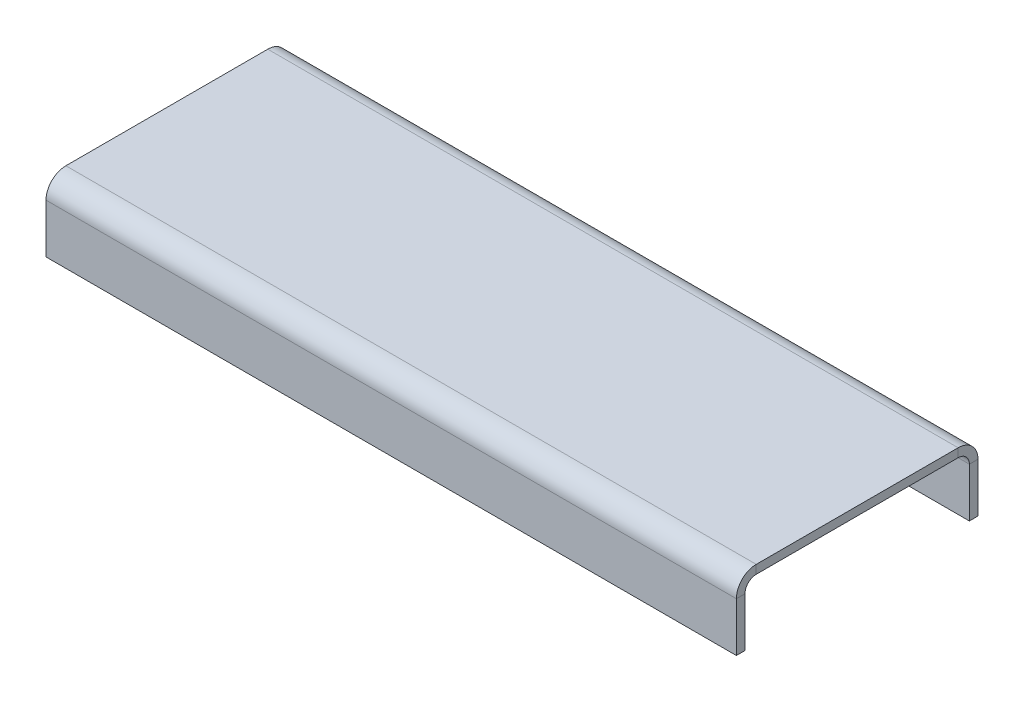
ISO-10303-21;
HEADER;
FILE_DESCRIPTION(('STEP AP214'),'2;1');
FILE_NAME('part.step','',(''),(''),'','','');
FILE_SCHEMA(('AUTOMOTIVE_DESIGN { 1 0 10303 214 1 1 1 1 }'));
ENDSEC;
DATA;
#1=APPLICATION_CONTEXT('core data for automotive mechanical design processes');
#2=APPLICATION_PROTOCOL_DEFINITION('international standard','automotive_design',2000,#1);
#3=PRODUCT_CONTEXT('',#1,'mechanical');
#4=PRODUCT('Part','Part','',(#3));
#5=PRODUCT_RELATED_PRODUCT_CATEGORY('part','',(#4));
#6=PRODUCT_DEFINITION_FORMATION('','',#4);
#7=PRODUCT_DEFINITION_CONTEXT('part definition',#1,'design');
#8=PRODUCT_DEFINITION('design','',#6,#7);
#9=PRODUCT_DEFINITION_SHAPE('','',#8);
#10=(LENGTH_UNIT() NAMED_UNIT(*) SI_UNIT(.MILLI.,.METRE.));
#11=(NAMED_UNIT(*) PLANE_ANGLE_UNIT() SI_UNIT($,.RADIAN.));
#12=(NAMED_UNIT(*) SI_UNIT($,.STERADIAN.) SOLID_ANGLE_UNIT());
#13=UNCERTAINTY_MEASURE_WITH_UNIT(LENGTH_MEASURE(1.E-05),#10,'distance_accuracy_value','');
#14=(GEOMETRIC_REPRESENTATION_CONTEXT(3) GLOBAL_UNCERTAINTY_ASSIGNED_CONTEXT((#13)) GLOBAL_UNIT_ASSIGNED_CONTEXT((#10,
#11,#12)) REPRESENTATION_CONTEXT('',''));
#15=CARTESIAN_POINT('',(0.,0.,0.));
#16=DIRECTION('',(0.,0.,1.));
#17=DIRECTION('',(1.,0.,0.));
#18=AXIS2_PLACEMENT_3D('',#15,#16,#17);
#19=CARTESIAN_POINT('',(0.,-10.,0.));
#20=DIRECTION('',(0.,-1.,0.));
#21=DIRECTION('',(0.,0.,-1.));
#22=AXIS2_PLACEMENT_3D('',#19,#20,#21);
#23=PLANE('',#22);
#24=DIRECTION('',(0.,0.,1.));
#25=VECTOR('',#24,1.);
#26=CARTESIAN_POINT('',(-400.,-10.,140.));
#27=LINE('',#26,#25);
#28=CARTESIAN_POINT('',(-400.,-10.,-117.));
#29=VERTEX_POINT('',#28);
#30=CARTESIAN_POINT('',(-400.,-10.,117.));
#31=VERTEX_POINT('',#30);
#32=EDGE_CURVE('E13',#29,#31,#27,.T.);
#33=ORIENTED_EDGE('',*,*,#32,.F.);
#34=DIRECTION('',(1.,0.,0.));
#35=VECTOR('',#34,1.);
#36=CARTESIAN_POINT('',(400.,-10.,-117.));
#37=LINE('',#36,#35);
#38=CARTESIAN_POINT('',(400.,-10.,-117.));
#39=VERTEX_POINT('',#38);
#40=EDGE_CURVE('E230',#39,#29,#37,.F.);
#41=ORIENTED_EDGE('',*,*,#40,.F.);
#42=DIRECTION('',(0.,0.,-1.));
#43=VECTOR('',#42,1.);
#44=CARTESIAN_POINT('',(400.,-10.,140.));
#45=LINE('',#44,#43);
#46=CARTESIAN_POINT('',(400.,-10.,117.));
#47=VERTEX_POINT('',#46);
#48=EDGE_CURVE('E87',#47,#39,#45,.T.);
#49=ORIENTED_EDGE('',*,*,#48,.F.);
#50=DIRECTION('',(-1.,0.,0.));
#51=VECTOR('',#50,1.);
#52=CARTESIAN_POINT('',(-400.,-10.,117.));
#53=LINE('',#52,#51);
#54=EDGE_CURVE('E284',#31,#47,#53,.F.);
#55=ORIENTED_EDGE('',*,*,#54,.F.);
#56=EDGE_LOOP('',(#33,#41,#49,#55));
#57=FACE_BOUND('',#56,.T.);
#58=ADVANCED_FACE('F78',(#57),#23,.T.);
#59=CARTESIAN_POINT('',(0.,0.,0.));
#60=DIRECTION('',(0.,-1.,0.));
#61=DIRECTION('',(0.,0.,-1.));
#62=AXIS2_PLACEMENT_3D('',#59,#60,#61);
#63=PLANE('',#62);
#64=DIRECTION('',(1.,0.,0.));
#65=VECTOR('',#64,1.);
#66=CARTESIAN_POINT('',(400.,0.,-117.));
#67=LINE('',#66,#65);
#68=CARTESIAN_POINT('',(400.,0.,-117.));
#69=VERTEX_POINT('',#68);
#70=CARTESIAN_POINT('',(-400.,0.,-117.));
#71=VERTEX_POINT('',#70);
#72=EDGE_CURVE('E176',#69,#71,#67,.F.);
#73=ORIENTED_EDGE('',*,*,#72,.T.);
#74=DIRECTION('',(0.,0.,1.));
#75=VECTOR('',#74,1.);
#76=CARTESIAN_POINT('',(-400.,0.,140.));
#77=LINE('',#76,#75);
#78=CARTESIAN_POINT('',(-400.,0.,117.));
#79=VERTEX_POINT('',#78);
#80=EDGE_CURVE('E82',#71,#79,#77,.T.);
#81=ORIENTED_EDGE('',*,*,#80,.T.);
#82=DIRECTION('',(-1.,0.,0.));
#83=VECTOR('',#82,1.);
#84=CARTESIAN_POINT('',(-400.,0.,117.));
#85=LINE('',#84,#83);
#86=CARTESIAN_POINT('',(400.,0.,117.));
#87=VERTEX_POINT('',#86);
#88=EDGE_CURVE('E272',#79,#87,#85,.F.);
#89=ORIENTED_EDGE('',*,*,#88,.T.);
#90=DIRECTION('',(0.,0.,-1.));
#91=VECTOR('',#90,1.);
#92=CARTESIAN_POINT('',(400.,0.,140.));
#93=LINE('',#92,#91);
#94=EDGE_CURVE('E290',#87,#69,#93,.T.);
#95=ORIENTED_EDGE('',*,*,#94,.T.);
#96=EDGE_LOOP('',(#73,#81,#89,#95));
#97=FACE_BOUND('',#96,.T.);
#98=ADVANCED_FACE('F296',(#97),#63,.F.);
#99=CARTESIAN_POINT('',(400.,-10.,140.));
#100=DIRECTION('',(1.,0.,0.));
#101=DIRECTION('',(0.,0.,-1.));
#102=AXIS2_PLACEMENT_3D('',#99,#100,#101);
#103=PLANE('',#102);
#104=ORIENTED_EDGE('',*,*,#48,.T.);
#105=DIRECTION('',(0.,1.,0.));
#106=VECTOR('',#105,1.);
#107=CARTESIAN_POINT('',(400.,-10.,-117.));
#108=LINE('',#107,#106);
#109=EDGE_CURVE('E226',#39,#69,#108,.T.);
#110=ORIENTED_EDGE('',*,*,#109,.T.);
#111=ORIENTED_EDGE('',*,*,#94,.F.);
#112=DIRECTION('',(0.,1.,0.));
#113=VECTOR('',#112,1.);
#114=CARTESIAN_POINT('',(400.,-10.,117.));
#115=LINE('',#114,#113);
#116=EDGE_CURVE('E101',#47,#87,#115,.T.);
#117=ORIENTED_EDGE('',*,*,#116,.F.);
#118=EDGE_LOOP('',(#104,#110,#111,#117));
#119=FACE_BOUND('',#118,.T.);
#120=ADVANCED_FACE('F80',(#119),#103,.T.);
#121=CARTESIAN_POINT('',(-400.,-10.,140.));
#122=DIRECTION('',(-1.,0.,0.));
#123=DIRECTION('',(0.,0.,1.));
#124=AXIS2_PLACEMENT_3D('',#121,#122,#123);
#125=PLANE('',#124);
#126=DIRECTION('',(0.,1.,0.));
#127=VECTOR('',#126,1.);
#128=CARTESIAN_POINT('',(-400.,-10.,-117.));
#129=LINE('',#128,#127);
#130=EDGE_CURVE('E234',#29,#71,#129,.T.);
#131=ORIENTED_EDGE('',*,*,#130,.F.);
#132=ORIENTED_EDGE('',*,*,#32,.T.);
#133=DIRECTION('',(0.,1.,0.));
#134=VECTOR('',#133,1.);
#135=CARTESIAN_POINT('',(-400.,-10.,117.));
#136=LINE('',#135,#134);
#137=EDGE_CURVE('E278',#31,#79,#136,.T.);
#138=ORIENTED_EDGE('',*,*,#137,.T.);
#139=ORIENTED_EDGE('',*,*,#80,.F.);
#140=EDGE_LOOP('',(#131,#132,#138,#139));
#141=FACE_BOUND('',#140,.T.);
#142=ADVANCED_FACE('F347',(#141),#125,.T.);
#143=CARTESIAN_POINT('',(400.,-22.9999999999999,117.));
#144=DIRECTION('',(1.,0.,0.));
#145=DIRECTION('',(0.,0.,-1.));
#146=AXIS2_PLACEMENT_3D('',#143,#144,#145);
#147=PLANE('',#146);
#148=DIRECTION('',(0.,0.,1.));
#149=VECTOR('',#148,1.);
#150=CARTESIAN_POINT('',(400.,-22.9999999999999,140.));
#151=LINE('',#150,#149);
#152=CARTESIAN_POINT('',(400.,-22.9999999999999,130.));
#153=VERTEX_POINT('',#152);
#154=CARTESIAN_POINT('',(400.,-22.9999999999999,140.));
#155=VERTEX_POINT('',#154);
#156=EDGE_CURVE('E237',#153,#155,#151,.T.);
#157=ORIENTED_EDGE('',*,*,#156,.F.);
#158=CARTESIAN_POINT('',(400.,-22.9999999999999,117.));
#159=DIRECTION('',(-1.,0.,0.));
#160=DIRECTION('',(0.,0.,1.));
#161=AXIS2_PLACEMENT_3D('',#158,#159,#160);
#162=CIRCLE('',#161,13.);
#163=EDGE_CURVE('E281',#47,#153,#162,.F.);
#164=ORIENTED_EDGE('',*,*,#163,.F.);
#165=ORIENTED_EDGE('',*,*,#116,.T.);
#166=CARTESIAN_POINT('',(400.,-22.9999999999999,117.));
#167=DIRECTION('',(-1.,0.,0.));
#168=DIRECTION('',(0.,0.,1.));
#169=AXIS2_PLACEMENT_3D('',#166,#167,#168);
#170=CIRCLE('',#169,23.);
#171=EDGE_CURVE('E274',#87,#155,#170,.F.);
#172=ORIENTED_EDGE('',*,*,#171,.T.);
#173=EDGE_LOOP('',(#157,#164,#165,#172));
#174=FACE_BOUND('',#173,.T.);
#175=ADVANCED_FACE('F322',(#174),#147,.T.);
#176=CARTESIAN_POINT('',(-400.,-22.9999999999999,117.));
#177=DIRECTION('',(1.,0.,0.));
#178=DIRECTION('',(0.,0.,-1.));
#179=AXIS2_PLACEMENT_3D('',#176,#177,#178);
#180=PLANE('',#179);
#181=CARTESIAN_POINT('',(-400.,-22.9999999999999,117.));
#182=DIRECTION('',(-1.,0.,0.));
#183=DIRECTION('',(0.,0.,1.));
#184=AXIS2_PLACEMENT_3D('',#181,#182,#183);
#185=CIRCLE('',#184,13.);
#186=CARTESIAN_POINT('',(-400.,-22.9999999999999,130.));
#187=VERTEX_POINT('',#186);
#188=EDGE_CURVE('E242',#187,#31,#185,.T.);
#189=ORIENTED_EDGE('',*,*,#188,.F.);
#190=DIRECTION('',(0.,0.,1.));
#191=VECTOR('',#190,1.);
#192=CARTESIAN_POINT('',(-400.,-22.9999999999999,130.));
#193=LINE('',#192,#191);
#194=CARTESIAN_POINT('',(-400.,-22.9999999999999,140.));
#195=VERTEX_POINT('',#194);
#196=EDGE_CURVE('E265',#187,#195,#193,.T.);
#197=ORIENTED_EDGE('',*,*,#196,.T.);
#198=CARTESIAN_POINT('',(-400.,-22.9999999999999,117.));
#199=DIRECTION('',(-1.,0.,0.));
#200=DIRECTION('',(0.,0.,1.));
#201=AXIS2_PLACEMENT_3D('',#198,#199,#200);
#202=CIRCLE('',#201,23.);
#203=EDGE_CURVE('E275',#195,#79,#202,.T.);
#204=ORIENTED_EDGE('',*,*,#203,.T.);
#205=ORIENTED_EDGE('',*,*,#137,.F.);
#206=EDGE_LOOP('',(#189,#197,#204,#205));
#207=FACE_BOUND('',#206,.T.);
#208=ADVANCED_FACE('F303',(#207),#180,.F.);
#209=CARTESIAN_POINT('',(-400.,-22.9999999999999,117.));
#210=DIRECTION('',(-1.,0.,0.));
#211=DIRECTION('',(0.,0.,1.));
#212=AXIS2_PLACEMENT_3D('',#209,#210,#211);
#213=CYLINDRICAL_SURFACE('',#212,23.);
#214=ORIENTED_EDGE('',*,*,#88,.F.);
#215=ORIENTED_EDGE('',*,*,#203,.F.);
#216=DIRECTION('',(-1.,0.,0.));
#217=VECTOR('',#216,1.);
#218=CARTESIAN_POINT('',(0.,-22.9999999999999,140.));
#219=LINE('',#218,#217);
#220=EDGE_CURVE('E262',#155,#195,#219,.T.);
#221=ORIENTED_EDGE('',*,*,#220,.F.);
#222=ORIENTED_EDGE('',*,*,#171,.F.);
#223=EDGE_LOOP('',(#214,#215,#221,#222));
#224=FACE_BOUND('',#223,.T.);
#225=ADVANCED_FACE('F299',(#224),#213,.T.);
#226=CARTESIAN_POINT('',(-400.,-22.9999999999999,117.));
#227=DIRECTION('',(-1.,0.,0.));
#228=DIRECTION('',(0.,0.,1.));
#229=AXIS2_PLACEMENT_3D('',#226,#227,#228);
#230=CYLINDRICAL_SURFACE('',#229,13.);
#231=ORIENTED_EDGE('',*,*,#54,.T.);
#232=ORIENTED_EDGE('',*,*,#163,.T.);
#233=DIRECTION('',(1.,0.,0.));
#234=VECTOR('',#233,1.);
#235=CARTESIAN_POINT('',(400.,-22.9999999999999,130.));
#236=LINE('',#235,#234);
#237=EDGE_CURVE('E268',#153,#187,#236,.F.);
#238=ORIENTED_EDGE('',*,*,#237,.T.);
#239=ORIENTED_EDGE('',*,*,#188,.T.);
#240=EDGE_LOOP('',(#231,#232,#238,#239));
#241=FACE_BOUND('',#240,.T.);
#242=ADVANCED_FACE('F325',(#241),#230,.F.);
#243=CARTESIAN_POINT('',(-400.,-10.,140.));
#244=DIRECTION('',(-1.,0.,0.));
#245=DIRECTION('',(0.,0.,1.));
#246=AXIS2_PLACEMENT_3D('',#243,#244,#245);
#247=PLANE('',#246);
#248=DIRECTION('',(0.,1.,0.));
#249=VECTOR('',#248,1.);
#250=CARTESIAN_POINT('',(-400.,-10.,140.));
#251=LINE('',#250,#249);
#252=CARTESIAN_POINT('',(-400.,-79.9999999999998,140.));
#253=VERTEX_POINT('',#252);
#254=EDGE_CURVE('E246',#253,#195,#251,.T.);
#255=ORIENTED_EDGE('',*,*,#254,.T.);
#256=ORIENTED_EDGE('',*,*,#196,.F.);
#257=DIRECTION('',(0.,-1.,0.));
#258=VECTOR('',#257,1.);
#259=CARTESIAN_POINT('',(-400.,5.55111512312578E-13,130.));
#260=LINE('',#259,#258);
#261=CARTESIAN_POINT('',(-400.,-80.,130.));
#262=VERTEX_POINT('',#261);
#263=EDGE_CURVE('E254',#262,#187,#260,.F.);
#264=ORIENTED_EDGE('',*,*,#263,.F.);
#265=DIRECTION('',(0.,0.,-1.));
#266=VECTOR('',#265,1.);
#267=CARTESIAN_POINT('',(-400.,-79.9999999999998,140.));
#268=LINE('',#267,#266);
#269=EDGE_CURVE('E240',#253,#262,#268,.T.);
#270=ORIENTED_EDGE('',*,*,#269,.F.);
#271=EDGE_LOOP('',(#255,#256,#264,#270));
#272=FACE_BOUND('',#271,.T.);
#273=ADVANCED_FACE('F312',(#272),#247,.T.);
#274=CARTESIAN_POINT('',(400.,-79.9999999999998,140.));
#275=DIRECTION('',(1.,0.,0.));
#276=DIRECTION('',(0.,0.,-1.));
#277=AXIS2_PLACEMENT_3D('',#274,#275,#276);
#278=PLANE('',#277);
#279=DIRECTION('',(0.,1.,0.));
#280=VECTOR('',#279,1.);
#281=CARTESIAN_POINT('',(400.,5.55111512312578E-13,130.));
#282=LINE('',#281,#280);
#283=CARTESIAN_POINT('',(400.,-80.,130.));
#284=VERTEX_POINT('',#283);
#285=EDGE_CURVE('E260',#153,#284,#282,.F.);
#286=ORIENTED_EDGE('',*,*,#285,.F.);
#287=ORIENTED_EDGE('',*,*,#156,.T.);
#288=DIRECTION('',(0.,-1.,0.));
#289=VECTOR('',#288,1.);
#290=CARTESIAN_POINT('',(400.,-79.9999999999998,140.));
#291=LINE('',#290,#289);
#292=CARTESIAN_POINT('',(400.,-79.9999999999998,140.));
#293=VERTEX_POINT('',#292);
#294=EDGE_CURVE('E252',#155,#293,#291,.T.);
#295=ORIENTED_EDGE('',*,*,#294,.T.);
#296=DIRECTION('',(0.,0.,-1.));
#297=VECTOR('',#296,1.);
#298=CARTESIAN_POINT('',(400.,-79.9999999999998,140.));
#299=LINE('',#298,#297);
#300=EDGE_CURVE('E243',#293,#284,#299,.T.);
#301=ORIENTED_EDGE('',*,*,#300,.T.);
#302=EDGE_LOOP('',(#286,#287,#295,#301));
#303=FACE_BOUND('',#302,.T.);
#304=ADVANCED_FACE('F319',(#303),#278,.T.);
#305=CARTESIAN_POINT('',(0.,5.55111512312578E-13,140.));
#306=DIRECTION('',(0.,0.,1.));
#307=DIRECTION('',(0.,-1.,0.));
#308=AXIS2_PLACEMENT_3D('',#305,#306,#307);
#309=PLANE('',#308);
#310=ORIENTED_EDGE('',*,*,#294,.F.);
#311=ORIENTED_EDGE('',*,*,#220,.T.);
#312=ORIENTED_EDGE('',*,*,#254,.F.);
#313=DIRECTION('',(-1.,0.,0.));
#314=VECTOR('',#313,1.);
#315=CARTESIAN_POINT('',(-400.,-79.9999999999998,140.));
#316=LINE('',#315,#314);
#317=EDGE_CURVE('E249',#293,#253,#316,.T.);
#318=ORIENTED_EDGE('',*,*,#317,.F.);
#319=EDGE_LOOP('',(#310,#311,#312,#318));
#320=FACE_BOUND('',#319,.T.);
#321=ADVANCED_FACE('F310',(#320),#309,.T.);
#322=CARTESIAN_POINT('',(0.,5.55111512312578E-13,130.));
#323=DIRECTION('',(0.,0.,1.));
#324=DIRECTION('',(0.,-1.,0.));
#325=AXIS2_PLACEMENT_3D('',#322,#323,#324);
#326=PLANE('',#325);
#327=ORIENTED_EDGE('',*,*,#237,.F.);
#328=ORIENTED_EDGE('',*,*,#285,.T.);
#329=DIRECTION('',(1.,0.,0.));
#330=VECTOR('',#329,1.);
#331=CARTESIAN_POINT('',(0.,-80.,130.));
#332=LINE('',#331,#330);
#333=EDGE_CURVE('E257',#284,#262,#332,.F.);
#334=ORIENTED_EDGE('',*,*,#333,.T.);
#335=ORIENTED_EDGE('',*,*,#263,.T.);
#336=EDGE_LOOP('',(#327,#328,#334,#335));
#337=FACE_BOUND('',#336,.T.);
#338=ADVANCED_FACE('F327',(#337),#326,.F.);
#339=CARTESIAN_POINT('',(-400.,-79.9999999999998,140.));
#340=DIRECTION('',(0.,-1.,0.));
#341=DIRECTION('',(0.,0.,-1.));
#342=AXIS2_PLACEMENT_3D('',#339,#340,#341);
#343=PLANE('',#342);
#344=ORIENTED_EDGE('',*,*,#333,.F.);
#345=ORIENTED_EDGE('',*,*,#300,.F.);
#346=ORIENTED_EDGE('',*,*,#317,.T.);
#347=ORIENTED_EDGE('',*,*,#269,.T.);
#348=EDGE_LOOP('',(#344,#345,#346,#347));
#349=FACE_BOUND('',#348,.T.);
#350=ADVANCED_FACE('F316',(#349),#343,.T.);
#351=CARTESIAN_POINT('',(-400.,-23.,-117.));
#352=DIRECTION('',(-1.,0.,0.));
#353=DIRECTION('',(0.,0.,1.));
#354=AXIS2_PLACEMENT_3D('',#351,#352,#353);
#355=PLANE('',#354);
#356=DIRECTION('',(0.,0.,-1.));
#357=VECTOR('',#356,1.);
#358=CARTESIAN_POINT('',(-400.,-22.9999999999999,-140.));
#359=LINE('',#358,#357);
#360=CARTESIAN_POINT('',(-400.,-23.,-130.));
#361=VERTEX_POINT('',#360);
#362=CARTESIAN_POINT('',(-400.,-23.,-140.));
#363=VERTEX_POINT('',#362);
#364=EDGE_CURVE('E221',#361,#363,#359,.T.);
#365=ORIENTED_EDGE('',*,*,#364,.F.);
#366=CARTESIAN_POINT('',(-400.,-23.,-117.));
#367=DIRECTION('',(1.,0.,0.));
#368=DIRECTION('',(0.,0.,-1.));
#369=AXIS2_PLACEMENT_3D('',#366,#367,#368);
#370=CIRCLE('',#369,13.);
#371=EDGE_CURVE('E179',#29,#361,#370,.F.);
#372=ORIENTED_EDGE('',*,*,#371,.F.);
#373=ORIENTED_EDGE('',*,*,#130,.T.);
#374=CARTESIAN_POINT('',(-400.,-23.,-117.));
#375=DIRECTION('',(1.,0.,0.));
#376=DIRECTION('',(0.,0.,-1.));
#377=AXIS2_PLACEMENT_3D('',#374,#375,#376);
#378=CIRCLE('',#377,23.);
#379=EDGE_CURVE('E225',#71,#363,#378,.F.);
#380=ORIENTED_EDGE('',*,*,#379,.T.);
#381=EDGE_LOOP('',(#365,#372,#373,#380));
#382=FACE_BOUND('',#381,.T.);
#383=ADVANCED_FACE('F334',(#382),#355,.T.);
#384=CARTESIAN_POINT('',(400.,-23.,-117.));
#385=DIRECTION('',(-1.,0.,0.));
#386=DIRECTION('',(0.,0.,1.));
#387=AXIS2_PLACEMENT_3D('',#384,#385,#386);
#388=PLANE('',#387);
#389=CARTESIAN_POINT('',(400.,-23.,-117.));
#390=DIRECTION('',(1.,0.,0.));
#391=DIRECTION('',(0.,0.,-1.));
#392=AXIS2_PLACEMENT_3D('',#389,#390,#391);
#393=CIRCLE('',#392,13.);
#394=CARTESIAN_POINT('',(400.,-23.,-130.));
#395=VERTEX_POINT('',#394);
#396=EDGE_CURVE('E186',#395,#39,#393,.T.);
#397=ORIENTED_EDGE('',*,*,#396,.F.);
#398=DIRECTION('',(0.,0.,-1.));
#399=VECTOR('',#398,1.);
#400=CARTESIAN_POINT('',(400.,-22.9999999999999,-130.));
#401=LINE('',#400,#399);
#402=CARTESIAN_POINT('',(400.,-22.9999999999999,-140.));
#403=VERTEX_POINT('',#402);
#404=EDGE_CURVE('E183',#395,#403,#401,.T.);
#405=ORIENTED_EDGE('',*,*,#404,.T.);
#406=CARTESIAN_POINT('',(400.,-23.,-117.));
#407=DIRECTION('',(1.,0.,0.));
#408=DIRECTION('',(0.,0.,-1.));
#409=AXIS2_PLACEMENT_3D('',#406,#407,#408);
#410=CIRCLE('',#409,23.);
#411=EDGE_CURVE('E169',#403,#69,#410,.T.);
#412=ORIENTED_EDGE('',*,*,#411,.T.);
#413=ORIENTED_EDGE('',*,*,#109,.F.);
#414=EDGE_LOOP('',(#397,#405,#412,#413));
#415=FACE_BOUND('',#414,.T.);
#416=ADVANCED_FACE('F184',(#415),#388,.F.);
#417=CARTESIAN_POINT('',(400.,-23.,-117.));
#418=DIRECTION('',(1.,0.,0.));
#419=DIRECTION('',(0.,0.,-1.));
#420=AXIS2_PLACEMENT_3D('',#417,#418,#419);
#421=CYLINDRICAL_SURFACE('',#420,23.);
#422=ORIENTED_EDGE('',*,*,#72,.F.);
#423=ORIENTED_EDGE('',*,*,#411,.F.);
#424=DIRECTION('',(1.,0.,0.));
#425=VECTOR('',#424,1.);
#426=CARTESIAN_POINT('',(0.,-22.9999999999999,-140.));
#427=LINE('',#426,#425);
#428=EDGE_CURVE('E174',#363,#403,#427,.T.);
#429=ORIENTED_EDGE('',*,*,#428,.F.);
#430=ORIENTED_EDGE('',*,*,#379,.F.);
#431=EDGE_LOOP('',(#422,#423,#429,#430));
#432=FACE_BOUND('',#431,.T.);
#433=ADVANCED_FACE('F171',(#432),#421,.T.);
#434=CARTESIAN_POINT('',(400.,-23.,-117.));
#435=DIRECTION('',(1.,0.,0.));
#436=DIRECTION('',(0.,0.,-1.));
#437=AXIS2_PLACEMENT_3D('',#434,#435,#436);
#438=CYLINDRICAL_SURFACE('',#437,13.);
#439=ORIENTED_EDGE('',*,*,#40,.T.);
#440=ORIENTED_EDGE('',*,*,#371,.T.);
#441=DIRECTION('',(-1.,0.,0.));
#442=VECTOR('',#441,1.);
#443=CARTESIAN_POINT('',(-400.,-22.9999999999999,-130.));
#444=LINE('',#443,#442);
#445=EDGE_CURVE('E191',#361,#395,#444,.F.);
#446=ORIENTED_EDGE('',*,*,#445,.T.);
#447=ORIENTED_EDGE('',*,*,#396,.T.);
#448=EDGE_LOOP('',(#439,#440,#446,#447));
#449=FACE_BOUND('',#448,.T.);
#450=ADVANCED_FACE('F356',(#449),#438,.F.);
#451=CARTESIAN_POINT('',(400.,-10.,-140.));
#452=DIRECTION('',(1.,0.,0.));
#453=DIRECTION('',(0.,0.,-1.));
#454=AXIS2_PLACEMENT_3D('',#451,#452,#453);
#455=PLANE('',#454);
#456=DIRECTION('',(0.,1.,0.));
#457=VECTOR('',#456,1.);
#458=CARTESIAN_POINT('',(400.,-10.,-140.));
#459=LINE('',#458,#457);
#460=CARTESIAN_POINT('',(400.,-79.9999999999998,-140.));
#461=VERTEX_POINT('',#460);
#462=EDGE_CURVE('E198',#461,#403,#459,.T.);
#463=ORIENTED_EDGE('',*,*,#462,.T.);
#464=ORIENTED_EDGE('',*,*,#404,.F.);
#465=DIRECTION('',(0.,-1.,0.));
#466=VECTOR('',#465,1.);
#467=CARTESIAN_POINT('',(400.,5.55111512312578E-13,-130.));
#468=LINE('',#467,#466);
#469=CARTESIAN_POINT('',(400.,-80.,-130.));
#470=VERTEX_POINT('',#469);
#471=EDGE_CURVE('E214',#470,#395,#468,.F.);
#472=ORIENTED_EDGE('',*,*,#471,.F.);
#473=DIRECTION('',(0.,0.,1.));
#474=VECTOR('',#473,1.);
#475=CARTESIAN_POINT('',(400.,-79.9999999999998,-140.));
#476=LINE('',#475,#474);
#477=EDGE_CURVE('E203',#461,#470,#476,.T.);
#478=ORIENTED_EDGE('',*,*,#477,.F.);
#479=EDGE_LOOP('',(#463,#464,#472,#478));
#480=FACE_BOUND('',#479,.T.);
#481=ADVANCED_FACE('F202',(#480),#455,.T.);
#482=CARTESIAN_POINT('',(-400.,-79.9999999999998,-140.));
#483=DIRECTION('',(-1.,0.,0.));
#484=DIRECTION('',(0.,0.,1.));
#485=AXIS2_PLACEMENT_3D('',#482,#483,#484);
#486=PLANE('',#485);
#487=DIRECTION('',(0.,1.,0.));
#488=VECTOR('',#487,1.);
#489=CARTESIAN_POINT('',(-400.,5.55111512312578E-13,-130.));
#490=LINE('',#489,#488);
#491=CARTESIAN_POINT('',(-400.,-80.,-130.));
#492=VERTEX_POINT('',#491);
#493=EDGE_CURVE('E200',#361,#492,#490,.F.);
#494=ORIENTED_EDGE('',*,*,#493,.F.);
#495=ORIENTED_EDGE('',*,*,#364,.T.);
#496=DIRECTION('',(0.,-1.,0.));
#497=VECTOR('',#496,1.);
#498=CARTESIAN_POINT('',(-400.,-79.9999999999998,-140.));
#499=LINE('',#498,#497);
#500=CARTESIAN_POINT('',(-400.,-79.9999999999998,-140.));
#501=VERTEX_POINT('',#500);
#502=EDGE_CURVE('E199',#363,#501,#499,.T.);
#503=ORIENTED_EDGE('',*,*,#502,.T.);
#504=DIRECTION('',(0.,0.,1.));
#505=VECTOR('',#504,1.);
#506=CARTESIAN_POINT('',(-400.,-79.9999999999998,-140.));
#507=LINE('',#506,#505);
#508=EDGE_CURVE('E205',#501,#492,#507,.T.);
#509=ORIENTED_EDGE('',*,*,#508,.T.);
#510=EDGE_LOOP('',(#494,#495,#503,#509));
#511=FACE_BOUND('',#510,.T.);
#512=ADVANCED_FACE('F360',(#511),#486,.T.);
#513=CARTESIAN_POINT('',(0.,5.55111512312578E-13,-140.));
#514=DIRECTION('',(0.,0.,-1.));
#515=DIRECTION('',(0.,1.,0.));
#516=AXIS2_PLACEMENT_3D('',#513,#514,#515);
#517=PLANE('',#516);
#518=ORIENTED_EDGE('',*,*,#502,.F.);
#519=ORIENTED_EDGE('',*,*,#428,.T.);
#520=ORIENTED_EDGE('',*,*,#462,.F.);
#521=DIRECTION('',(1.,0.,0.));
#522=VECTOR('',#521,1.);
#523=CARTESIAN_POINT('',(400.,-79.9999999999998,-140.));
#524=LINE('',#523,#522);
#525=EDGE_CURVE('E206',#501,#461,#524,.T.);
#526=ORIENTED_EDGE('',*,*,#525,.F.);
#527=EDGE_LOOP('',(#518,#519,#520,#526));
#528=FACE_BOUND('',#527,.T.);
#529=ADVANCED_FACE('F196',(#528),#517,.T.);
#530=CARTESIAN_POINT('',(0.,5.55111512312578E-13,-130.));
#531=DIRECTION('',(0.,0.,-1.));
#532=DIRECTION('',(0.,1.,0.));
#533=AXIS2_PLACEMENT_3D('',#530,#531,#532);
#534=PLANE('',#533);
#535=ORIENTED_EDGE('',*,*,#445,.F.);
#536=ORIENTED_EDGE('',*,*,#493,.T.);
#537=DIRECTION('',(-1.,0.,0.));
#538=VECTOR('',#537,1.);
#539=CARTESIAN_POINT('',(0.,-80.,-130.));
#540=LINE('',#539,#538);
#541=EDGE_CURVE('E216',#492,#470,#540,.F.);
#542=ORIENTED_EDGE('',*,*,#541,.T.);
#543=ORIENTED_EDGE('',*,*,#471,.T.);
#544=EDGE_LOOP('',(#535,#536,#542,#543));
#545=FACE_BOUND('',#544,.T.);
#546=ADVANCED_FACE('F364',(#545),#534,.F.);
#547=CARTESIAN_POINT('',(400.,-79.9999999999998,-140.));
#548=DIRECTION('',(0.,-1.,0.));
#549=DIRECTION('',(0.,0.,-1.));
#550=AXIS2_PLACEMENT_3D('',#547,#548,#549);
#551=PLANE('',#550);
#552=ORIENTED_EDGE('',*,*,#541,.F.);
#553=ORIENTED_EDGE('',*,*,#508,.F.);
#554=ORIENTED_EDGE('',*,*,#525,.T.);
#555=ORIENTED_EDGE('',*,*,#477,.T.);
#556=EDGE_LOOP('',(#552,#553,#554,#555));
#557=FACE_BOUND('',#556,.T.);
#558=ADVANCED_FACE('F366',(#557),#551,.T.);
#559=CLOSED_SHELL('',(#58,#98,#120,#142,#175,#208,#225,#242,#273,#304,#321,#338,#350,#383,#416,
#433,#450,#481,#512,#529,#546,#558));
#560=MANIFOLD_SOLID_BREP('B2',#559);
#561=ADVANCED_BREP_SHAPE_REPRESENTATION('',(#18,#560),#14);
#562=SHAPE_DEFINITION_REPRESENTATION(#9,#561);
ENDSEC;
END-ISO-10303-21;
